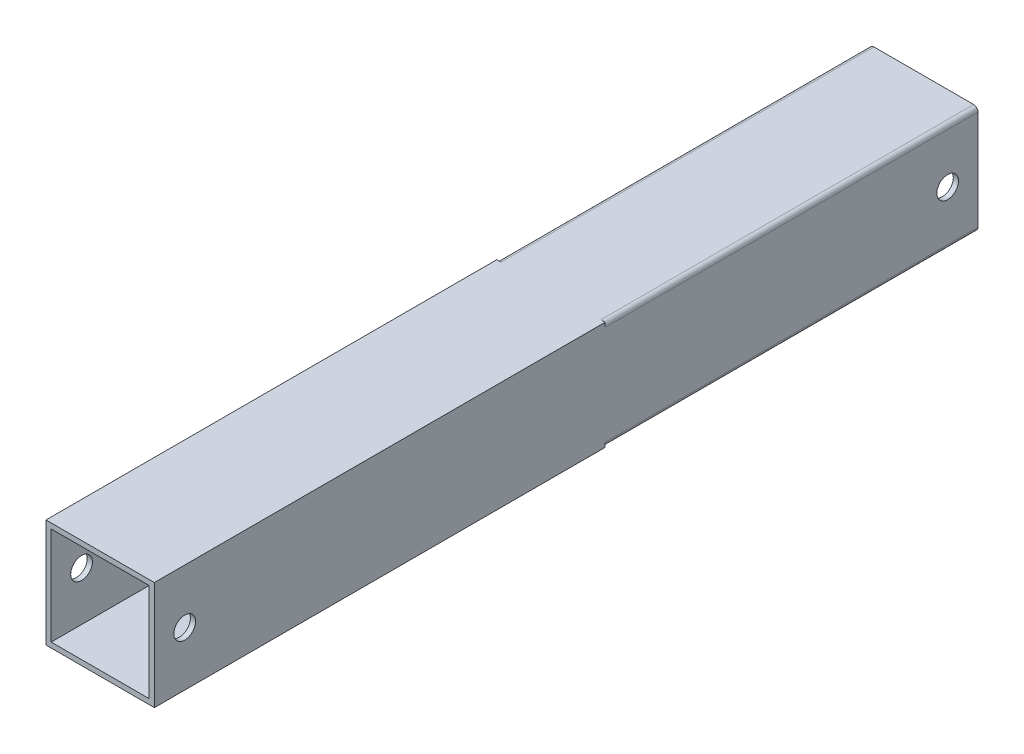
ISO-10303-21;
HEADER;
FILE_DESCRIPTION(('STEP AP214'),'2;1');
FILE_NAME('part.step','',(''),(''),'','','');
FILE_SCHEMA(('AUTOMOTIVE_DESIGN { 1 0 10303 214 1 1 1 1 }'));
ENDSEC;
DATA;
#1=APPLICATION_CONTEXT('core data for automotive mechanical design processes');
#2=APPLICATION_PROTOCOL_DEFINITION('international standard','automotive_design',2000,#1);
#3=PRODUCT_CONTEXT('',#1,'mechanical');
#4=PRODUCT('Part','Part','',(#3));
#5=PRODUCT_RELATED_PRODUCT_CATEGORY('part','',(#4));
#6=PRODUCT_DEFINITION_FORMATION('','',#4);
#7=PRODUCT_DEFINITION_CONTEXT('part definition',#1,'design');
#8=PRODUCT_DEFINITION('design','',#6,#7);
#9=PRODUCT_DEFINITION_SHAPE('','',#8);
#10=(LENGTH_UNIT() NAMED_UNIT(*) SI_UNIT(.MILLI.,.METRE.));
#11=(NAMED_UNIT(*) PLANE_ANGLE_UNIT() SI_UNIT($,.RADIAN.));
#12=(NAMED_UNIT(*) SI_UNIT($,.STERADIAN.) SOLID_ANGLE_UNIT());
#13=UNCERTAINTY_MEASURE_WITH_UNIT(LENGTH_MEASURE(1.E-05),#10,'distance_accuracy_value','');
#14=(GEOMETRIC_REPRESENTATION_CONTEXT(3) GLOBAL_UNCERTAINTY_ASSIGNED_CONTEXT((#13)) GLOBAL_UNIT_ASSIGNED_CONTEXT((#10,
#11,#12)) REPRESENTATION_CONTEXT('',''));
#15=CARTESIAN_POINT('',(0.,0.,0.));
#16=DIRECTION('',(0.,0.,1.));
#17=DIRECTION('',(1.,0.,0.));
#18=AXIS2_PLACEMENT_3D('',#15,#16,#17);
#19=CARTESIAN_POINT('',(0.,0.,0.));
#20=DIRECTION('',(0.,0.,1.));
#21=DIRECTION('',(1.,0.,0.));
#22=AXIS2_PLACEMENT_3D('',#19,#20,#21);
#23=PLANE('',#22);
#24=DIRECTION('',(0.,-1.,0.));
#25=VECTOR('',#24,1.);
#26=CARTESIAN_POINT('',(-11.3,11.3,0.));
#27=LINE('',#26,#25);
#28=CARTESIAN_POINT('',(-11.3,11.3,0.));
#29=VERTEX_POINT('',#28);
#30=CARTESIAN_POINT('',(-11.3,-11.3,0.));
#31=VERTEX_POINT('',#30);
#32=EDGE_CURVE('E203',#29,#31,#27,.T.);
#33=ORIENTED_EDGE('',*,*,#32,.T.);
#34=DIRECTION('',(1.,0.,0.));
#35=VECTOR('',#34,1.);
#36=CARTESIAN_POINT('',(-11.3,-11.3,0.));
#37=LINE('',#36,#35);
#38=CARTESIAN_POINT('',(11.3,-11.3,0.));
#39=VERTEX_POINT('',#38);
#40=EDGE_CURVE('E217',#31,#39,#37,.T.);
#41=ORIENTED_EDGE('',*,*,#40,.T.);
#42=DIRECTION('',(0.,1.,0.));
#43=VECTOR('',#42,1.);
#44=CARTESIAN_POINT('',(11.3,11.3,0.));
#45=LINE('',#44,#43);
#46=CARTESIAN_POINT('',(11.3,11.3,0.));
#47=VERTEX_POINT('',#46);
#48=EDGE_CURVE('E220',#39,#47,#45,.T.);
#49=ORIENTED_EDGE('',*,*,#48,.T.);
#50=DIRECTION('',(-1.,0.,0.));
#51=VECTOR('',#50,1.);
#52=CARTESIAN_POINT('',(-11.3,11.3,0.));
#53=LINE('',#52,#51);
#54=EDGE_CURVE('E207',#47,#29,#53,.T.);
#55=ORIENTED_EDGE('',*,*,#54,.T.);
#56=EDGE_LOOP('',(#33,#41,#49,#55));
#57=FACE_BOUND('',#56,.T.);
#58=CARTESIAN_POINT('',(-11.5,11.5,0.));
#59=DIRECTION('',(0.,0.,-1.));
#60=DIRECTION('',(1.,0.,0.));
#61=AXIS2_PLACEMENT_3D('',#58,#59,#60);
#62=CIRCLE('',#61,1.);
#63=CARTESIAN_POINT('',(-12.5,11.5,0.));
#64=VERTEX_POINT('',#63);
#65=CARTESIAN_POINT('',(-11.5,12.5,0.));
#66=VERTEX_POINT('',#65);
#67=EDGE_CURVE('E55',#64,#66,#62,.T.);
#68=ORIENTED_EDGE('',*,*,#67,.T.);
#69=DIRECTION('',(-1.,0.,0.));
#70=VECTOR('',#69,1.);
#71=CARTESIAN_POINT('',(-12.5,12.5,0.));
#72=LINE('',#71,#70);
#73=CARTESIAN_POINT('',(11.5,12.5,0.));
#74=VERTEX_POINT('',#73);
#75=EDGE_CURVE('E167',#74,#66,#72,.T.);
#76=ORIENTED_EDGE('',*,*,#75,.F.);
#77=CARTESIAN_POINT('',(11.5,11.5,0.));
#78=DIRECTION('',(0.,0.,-1.));
#79=DIRECTION('',(1.,0.,0.));
#80=AXIS2_PLACEMENT_3D('',#77,#78,#79);
#81=CIRCLE('',#80,1.);
#82=CARTESIAN_POINT('',(12.5,11.5,0.));
#83=VERTEX_POINT('',#82);
#84=EDGE_CURVE('E47',#74,#83,#81,.T.);
#85=ORIENTED_EDGE('',*,*,#84,.T.);
#86=DIRECTION('',(0.,1.,0.));
#87=VECTOR('',#86,1.);
#88=CARTESIAN_POINT('',(12.5,12.5,0.));
#89=LINE('',#88,#87);
#90=CARTESIAN_POINT('',(12.5,-11.5,0.));
#91=VERTEX_POINT('',#90);
#92=EDGE_CURVE('E234',#91,#83,#89,.T.);
#93=ORIENTED_EDGE('',*,*,#92,.F.);
#94=CARTESIAN_POINT('',(11.5,-11.5,0.));
#95=DIRECTION('',(0.,0.,-1.));
#96=DIRECTION('',(-1.,0.,0.));
#97=AXIS2_PLACEMENT_3D('',#94,#95,#96);
#98=CIRCLE('',#97,1.);
#99=CARTESIAN_POINT('',(11.5,-12.5,0.));
#100=VERTEX_POINT('',#99);
#101=EDGE_CURVE('E370',#91,#100,#98,.T.);
#102=ORIENTED_EDGE('',*,*,#101,.T.);
#103=DIRECTION('',(1.,0.,0.));
#104=VECTOR('',#103,1.);
#105=CARTESIAN_POINT('',(-12.5,-12.5,0.));
#106=LINE('',#105,#104);
#107=CARTESIAN_POINT('',(-11.5,-12.5,0.));
#108=VERTEX_POINT('',#107);
#109=EDGE_CURVE('E239',#108,#100,#106,.T.);
#110=ORIENTED_EDGE('',*,*,#109,.F.);
#111=CARTESIAN_POINT('',(-11.5,-11.5,0.));
#112=DIRECTION('',(0.,0.,-1.));
#113=DIRECTION('',(1.,0.,0.));
#114=AXIS2_PLACEMENT_3D('',#111,#112,#113);
#115=CIRCLE('',#114,1.);
#116=CARTESIAN_POINT('',(-12.5,-11.5,0.));
#117=VERTEX_POINT('',#116);
#118=EDGE_CURVE('E162',#108,#117,#115,.T.);
#119=ORIENTED_EDGE('',*,*,#118,.T.);
#120=DIRECTION('',(0.,-1.,0.));
#121=VECTOR('',#120,1.);
#122=CARTESIAN_POINT('',(-12.5,12.5,0.));
#123=LINE('',#122,#121);
#124=EDGE_CURVE('E249',#64,#117,#123,.T.);
#125=ORIENTED_EDGE('',*,*,#124,.F.);
#126=EDGE_LOOP('',(#68,#76,#85,#93,#102,#110,#119,#125));
#127=FACE_BOUND('',#126,.T.);
#128=ADVANCED_FACE('F32',(#57,#127),#23,.F.);
#129=CARTESIAN_POINT('',(-12.5,12.5,190.));
#130=DIRECTION('',(0.,-1.,0.));
#131=DIRECTION('',(0.,0.,-1.));
#132=AXIS2_PLACEMENT_3D('',#129,#130,#131);
#133=PLANE('',#132);
#134=DIRECTION('',(0.,0.,-1.));
#135=VECTOR('',#134,1.);
#136=CARTESIAN_POINT('',(-11.5,12.5,86.));
#137=LINE('',#136,#135);
#138=CARTESIAN_POINT('',(-11.5,12.5,86.));
#139=VERTEX_POINT('',#138);
#140=EDGE_CURVE('E159',#139,#66,#137,.T.);
#141=ORIENTED_EDGE('',*,*,#140,.F.);
#142=DIRECTION('',(1.,0.,0.));
#143=VECTOR('',#142,1.);
#144=CARTESIAN_POINT('',(-12.5,12.5,86.));
#145=LINE('',#144,#143);
#146=CARTESIAN_POINT('',(-12.5,12.5,86.));
#147=VERTEX_POINT('',#146);
#148=EDGE_CURVE('E146',#147,#139,#145,.T.);
#149=ORIENTED_EDGE('',*,*,#148,.F.);
#150=DIRECTION('',(0.,0.,-1.));
#151=VECTOR('',#150,1.);
#152=CARTESIAN_POINT('',(-12.5,12.5,190.));
#153=LINE('',#152,#151);
#154=CARTESIAN_POINT('',(-12.5,12.5,190.));
#155=VERTEX_POINT('',#154);
#156=EDGE_CURVE('E259',#155,#147,#153,.T.);
#157=ORIENTED_EDGE('',*,*,#156,.F.);
#158=DIRECTION('',(-1.,0.,0.));
#159=VECTOR('',#158,1.);
#160=CARTESIAN_POINT('',(-12.5,12.5,190.));
#161=LINE('',#160,#159);
#162=CARTESIAN_POINT('',(12.5,12.5,190.));
#163=VERTEX_POINT('',#162);
#164=EDGE_CURVE('E238',#163,#155,#161,.T.);
#165=ORIENTED_EDGE('',*,*,#164,.F.);
#166=DIRECTION('',(0.,0.,-1.));
#167=VECTOR('',#166,1.);
#168=CARTESIAN_POINT('',(12.5,12.5,190.));
#169=LINE('',#168,#167);
#170=CARTESIAN_POINT('',(12.5,12.5,86.));
#171=VERTEX_POINT('',#170);
#172=EDGE_CURVE('E261',#163,#171,#169,.T.);
#173=ORIENTED_EDGE('',*,*,#172,.T.);
#174=CARTESIAN_POINT('',(11.5,12.5,86.));
#175=VERTEX_POINT('',#174);
#176=EDGE_CURVE('E156',#175,#171,#145,.T.);
#177=ORIENTED_EDGE('',*,*,#176,.F.);
#178=DIRECTION('',(0.,0.,-1.));
#179=VECTOR('',#178,1.);
#180=CARTESIAN_POINT('',(11.5,12.5,86.));
#181=LINE('',#180,#179);
#182=EDGE_CURVE('E168',#175,#74,#181,.T.);
#183=ORIENTED_EDGE('',*,*,#182,.T.);
#184=ORIENTED_EDGE('',*,*,#75,.T.);
#185=EDGE_LOOP('',(#141,#149,#157,#165,#173,#177,#183,#184));
#186=FACE_BOUND('',#185,.T.);
#187=ADVANCED_FACE('F165',(#186),#133,.F.);
#188=CARTESIAN_POINT('',(0.,0.,190.));
#189=DIRECTION('',(0.,0.,1.));
#190=DIRECTION('',(1.,0.,0.));
#191=AXIS2_PLACEMENT_3D('',#188,#189,#190);
#192=PLANE('',#191);
#193=DIRECTION('',(0.,1.,0.));
#194=VECTOR('',#193,1.);
#195=CARTESIAN_POINT('',(12.5,12.5,190.));
#196=LINE('',#195,#194);
#197=CARTESIAN_POINT('',(12.5,-12.5,190.));
#198=VERTEX_POINT('',#197);
#199=EDGE_CURVE('E235',#198,#163,#196,.T.);
#200=ORIENTED_EDGE('',*,*,#199,.T.);
#201=ORIENTED_EDGE('',*,*,#164,.T.);
#202=DIRECTION('',(0.,-1.,0.));
#203=VECTOR('',#202,1.);
#204=CARTESIAN_POINT('',(-12.5,12.5,190.));
#205=LINE('',#204,#203);
#206=CARTESIAN_POINT('',(-12.5,-12.5,190.));
#207=VERTEX_POINT('',#206);
#208=EDGE_CURVE('E241',#155,#207,#205,.T.);
#209=ORIENTED_EDGE('',*,*,#208,.T.);
#210=DIRECTION('',(1.,0.,0.));
#211=VECTOR('',#210,1.);
#212=CARTESIAN_POINT('',(-12.5,-12.5,190.));
#213=LINE('',#212,#211);
#214=EDGE_CURVE('E243',#207,#198,#213,.T.);
#215=ORIENTED_EDGE('',*,*,#214,.T.);
#216=EDGE_LOOP('',(#200,#201,#209,#215));
#217=FACE_BOUND('',#216,.T.);
#218=DIRECTION('',(1.,0.,0.));
#219=VECTOR('',#218,1.);
#220=CARTESIAN_POINT('',(-11.3,-11.3,190.));
#221=LINE('',#220,#219);
#222=CARTESIAN_POINT('',(-11.3,-11.3,190.));
#223=VERTEX_POINT('',#222);
#224=CARTESIAN_POINT('',(11.3,-11.3,190.));
#225=VERTEX_POINT('',#224);
#226=EDGE_CURVE('E206',#223,#225,#221,.T.);
#227=ORIENTED_EDGE('',*,*,#226,.F.);
#228=DIRECTION('',(0.,-1.,0.));
#229=VECTOR('',#228,1.);
#230=CARTESIAN_POINT('',(-11.3,11.3,190.));
#231=LINE('',#230,#229);
#232=CARTESIAN_POINT('',(-11.3,11.3,190.));
#233=VERTEX_POINT('',#232);
#234=EDGE_CURVE('E204',#233,#223,#231,.T.);
#235=ORIENTED_EDGE('',*,*,#234,.F.);
#236=DIRECTION('',(-1.,0.,0.));
#237=VECTOR('',#236,1.);
#238=CARTESIAN_POINT('',(-11.3,11.3,190.));
#239=LINE('',#238,#237);
#240=CARTESIAN_POINT('',(11.3,11.3,190.));
#241=VERTEX_POINT('',#240);
#242=EDGE_CURVE('E212',#241,#233,#239,.T.);
#243=ORIENTED_EDGE('',*,*,#242,.F.);
#244=DIRECTION('',(0.,1.,0.));
#245=VECTOR('',#244,1.);
#246=CARTESIAN_POINT('',(11.3,11.3,190.));
#247=LINE('',#246,#245);
#248=EDGE_CURVE('E209',#225,#241,#247,.T.);
#249=ORIENTED_EDGE('',*,*,#248,.F.);
#250=EDGE_LOOP('',(#227,#235,#243,#249));
#251=FACE_BOUND('',#250,.T.);
#252=ADVANCED_FACE('F294',(#217,#251),#192,.T.);
#253=CARTESIAN_POINT('',(12.5,12.5,190.));
#254=DIRECTION('',(-1.,0.,0.));
#255=DIRECTION('',(0.,-1.,0.));
#256=AXIS2_PLACEMENT_3D('',#253,#254,#255);
#257=PLANE('',#256);
#258=CARTESIAN_POINT('',(12.5,0.,7.));
#259=DIRECTION('',(1.,0.,0.));
#260=DIRECTION('',(0.,1.,0.));
#261=AXIS2_PLACEMENT_3D('',#258,#259,#260);
#262=CIRCLE('',#261,2.5);
#263=CARTESIAN_POINT('',(12.5,2.5,7.));
#264=VERTEX_POINT('',#263);
#265=EDGE_CURVE('E193',#264,#264,#262,.T.);
#266=ORIENTED_EDGE('',*,*,#265,.F.);
#267=EDGE_LOOP('',(#266));
#268=FACE_BOUND('',#267,.T.);
#269=DIRECTION('',(0.,0.,-1.));
#270=VECTOR('',#269,1.);
#271=CARTESIAN_POINT('',(12.5,11.5,86.));
#272=LINE('',#271,#270);
#273=CARTESIAN_POINT('',(12.5,11.5,86.));
#274=VERTEX_POINT('',#273);
#275=EDGE_CURVE('E171',#274,#83,#272,.T.);
#276=ORIENTED_EDGE('',*,*,#275,.F.);
#277=DIRECTION('',(0.,-1.,0.));
#278=VECTOR('',#277,1.);
#279=CARTESIAN_POINT('',(12.5,12.5,86.));
#280=LINE('',#279,#278);
#281=EDGE_CURVE('E181',#171,#274,#280,.T.);
#282=ORIENTED_EDGE('',*,*,#281,.F.);
#283=ORIENTED_EDGE('',*,*,#172,.F.);
#284=ORIENTED_EDGE('',*,*,#199,.F.);
#285=DIRECTION('',(0.,0.,-1.));
#286=VECTOR('',#285,1.);
#287=CARTESIAN_POINT('',(12.5,-12.5,190.));
#288=LINE('',#287,#286);
#289=CARTESIAN_POINT('',(12.5,-12.5,86.));
#290=VERTEX_POINT('',#289);
#291=EDGE_CURVE('E245',#198,#290,#288,.T.);
#292=ORIENTED_EDGE('',*,*,#291,.T.);
#293=CARTESIAN_POINT('',(12.5,-11.5,86.));
#294=VERTEX_POINT('',#293);
#295=EDGE_CURVE('E180',#294,#290,#280,.T.);
#296=ORIENTED_EDGE('',*,*,#295,.F.);
#297=DIRECTION('',(0.,0.,-1.));
#298=VECTOR('',#297,1.);
#299=CARTESIAN_POINT('',(12.5,-11.5,86.));
#300=LINE('',#299,#298);
#301=EDGE_CURVE('E386',#294,#91,#300,.T.);
#302=ORIENTED_EDGE('',*,*,#301,.T.);
#303=ORIENTED_EDGE('',*,*,#92,.T.);
#304=EDGE_LOOP('',(#276,#282,#283,#284,#292,#296,#302,#303));
#305=FACE_BOUND('',#304,.T.);
#306=CARTESIAN_POINT('',(12.5,0.,183.));
#307=DIRECTION('',(1.,0.,0.));
#308=DIRECTION('',(0.,1.,0.));
#309=AXIS2_PLACEMENT_3D('',#306,#307,#308);
#310=CIRCLE('',#309,2.5);
#311=CARTESIAN_POINT('',(12.5,2.49999999999997,183.));
#312=VERTEX_POINT('',#311);
#313=EDGE_CURVE('E187',#312,#312,#310,.T.);
#314=ORIENTED_EDGE('',*,*,#313,.F.);
#315=EDGE_LOOP('',(#314));
#316=FACE_BOUND('',#315,.T.);
#317=ADVANCED_FACE('F34',(#268,#305,#316),#257,.F.);
#318=CARTESIAN_POINT('',(-12.5,12.5,190.));
#319=DIRECTION('',(1.,0.,0.));
#320=DIRECTION('',(0.,1.,0.));
#321=AXIS2_PLACEMENT_3D('',#318,#319,#320);
#322=PLANE('',#321);
#323=CARTESIAN_POINT('',(-12.5,0.,7.));
#324=DIRECTION('',(1.,0.,0.));
#325=DIRECTION('',(0.,1.,0.));
#326=AXIS2_PLACEMENT_3D('',#323,#324,#325);
#327=CIRCLE('',#326,2.5);
#328=CARTESIAN_POINT('',(-12.5,2.5,7.));
#329=VERTEX_POINT('',#328);
#330=EDGE_CURVE('E194',#329,#329,#327,.T.);
#331=ORIENTED_EDGE('',*,*,#330,.T.);
#332=EDGE_LOOP('',(#331));
#333=FACE_BOUND('',#332,.T.);
#334=DIRECTION('',(0.,0.,-1.));
#335=VECTOR('',#334,1.);
#336=CARTESIAN_POINT('',(-12.5,-11.5,86.));
#337=LINE('',#336,#335);
#338=CARTESIAN_POINT('',(-12.5,-11.5,86.));
#339=VERTEX_POINT('',#338);
#340=EDGE_CURVE('E329',#339,#117,#337,.T.);
#341=ORIENTED_EDGE('',*,*,#340,.F.);
#342=DIRECTION('',(0.,1.,0.));
#343=VECTOR('',#342,1.);
#344=CARTESIAN_POINT('',(-12.5,12.5,86.));
#345=LINE('',#344,#343);
#346=CARTESIAN_POINT('',(-12.5,-12.5,86.));
#347=VERTEX_POINT('',#346);
#348=EDGE_CURVE('E178',#347,#339,#345,.T.);
#349=ORIENTED_EDGE('',*,*,#348,.F.);
#350=DIRECTION('',(0.,0.,-1.));
#351=VECTOR('',#350,1.);
#352=CARTESIAN_POINT('',(-12.5,-12.5,190.));
#353=LINE('',#352,#351);
#354=EDGE_CURVE('E256',#207,#347,#353,.T.);
#355=ORIENTED_EDGE('',*,*,#354,.F.);
#356=ORIENTED_EDGE('',*,*,#208,.F.);
#357=ORIENTED_EDGE('',*,*,#156,.T.);
#358=CARTESIAN_POINT('',(-12.5,11.5,86.));
#359=VERTEX_POINT('',#358);
#360=EDGE_CURVE('E151',#359,#147,#345,.T.);
#361=ORIENTED_EDGE('',*,*,#360,.F.);
#362=DIRECTION('',(0.,0.,-1.));
#363=VECTOR('',#362,1.);
#364=CARTESIAN_POINT('',(-12.5,11.5,86.));
#365=LINE('',#364,#363);
#366=EDGE_CURVE('E160',#359,#64,#365,.T.);
#367=ORIENTED_EDGE('',*,*,#366,.T.);
#368=ORIENTED_EDGE('',*,*,#124,.T.);
#369=EDGE_LOOP('',(#341,#349,#355,#356,#357,#361,#367,#368));
#370=FACE_BOUND('',#369,.T.);
#371=CARTESIAN_POINT('',(-12.5,0.,183.));
#372=DIRECTION('',(1.,0.,0.));
#373=DIRECTION('',(0.,1.,0.));
#374=AXIS2_PLACEMENT_3D('',#371,#372,#373);
#375=CIRCLE('',#374,2.5);
#376=CARTESIAN_POINT('',(-12.5,2.49999999999997,183.));
#377=VERTEX_POINT('',#376);
#378=EDGE_CURVE('E183',#377,#377,#375,.T.);
#379=ORIENTED_EDGE('',*,*,#378,.T.);
#380=EDGE_LOOP('',(#379));
#381=FACE_BOUND('',#380,.T.);
#382=ADVANCED_FACE('F316',(#333,#370,#381),#322,.F.);
#383=CARTESIAN_POINT('',(-12.5,-12.5,190.));
#384=DIRECTION('',(0.,1.,0.));
#385=DIRECTION('',(0.,0.,1.));
#386=AXIS2_PLACEMENT_3D('',#383,#384,#385);
#387=PLANE('',#386);
#388=DIRECTION('',(0.,0.,-1.));
#389=VECTOR('',#388,1.);
#390=CARTESIAN_POINT('',(11.5,-12.5,86.));
#391=LINE('',#390,#389);
#392=CARTESIAN_POINT('',(11.5,-12.5,86.));
#393=VERTEX_POINT('',#392);
#394=EDGE_CURVE('E374',#393,#100,#391,.T.);
#395=ORIENTED_EDGE('',*,*,#394,.F.);
#396=DIRECTION('',(-1.,0.,0.));
#397=VECTOR('',#396,1.);
#398=CARTESIAN_POINT('',(-12.5,-12.5,86.));
#399=LINE('',#398,#397);
#400=EDGE_CURVE('E11',#290,#393,#399,.T.);
#401=ORIENTED_EDGE('',*,*,#400,.F.);
#402=ORIENTED_EDGE('',*,*,#291,.F.);
#403=ORIENTED_EDGE('',*,*,#214,.F.);
#404=ORIENTED_EDGE('',*,*,#354,.T.);
#405=CARTESIAN_POINT('',(-11.5,-12.5,86.));
#406=VERTEX_POINT('',#405);
#407=EDGE_CURVE('E40',#406,#347,#399,.T.);
#408=ORIENTED_EDGE('',*,*,#407,.F.);
#409=DIRECTION('',(0.,0.,-1.));
#410=VECTOR('',#409,1.);
#411=CARTESIAN_POINT('',(-11.5,-12.5,86.));
#412=LINE('',#411,#410);
#413=EDGE_CURVE('E366',#406,#108,#412,.T.);
#414=ORIENTED_EDGE('',*,*,#413,.T.);
#415=ORIENTED_EDGE('',*,*,#109,.T.);
#416=EDGE_LOOP('',(#395,#401,#402,#403,#404,#408,#414,#415));
#417=FACE_BOUND('',#416,.T.);
#418=ADVANCED_FACE('F313',(#417),#387,.F.);
#419=CARTESIAN_POINT('',(-11.3,11.3,190.));
#420=DIRECTION('',(1.,0.,0.));
#421=DIRECTION('',(0.,1.,0.));
#422=AXIS2_PLACEMENT_3D('',#419,#420,#421);
#423=PLANE('',#422);
#424=CARTESIAN_POINT('',(-11.3,0.,183.));
#425=DIRECTION('',(1.,0.,0.));
#426=DIRECTION('',(0.,1.,0.));
#427=AXIS2_PLACEMENT_3D('',#424,#425,#426);
#428=CIRCLE('',#427,2.5);
#429=CARTESIAN_POINT('',(-11.3,2.49999999999997,183.));
#430=VERTEX_POINT('',#429);
#431=EDGE_CURVE('E190',#430,#430,#428,.T.);
#432=ORIENTED_EDGE('',*,*,#431,.F.);
#433=EDGE_LOOP('',(#432));
#434=FACE_BOUND('',#433,.T.);
#435=CARTESIAN_POINT('',(-11.3,0.,7.));
#436=DIRECTION('',(1.,0.,0.));
#437=DIRECTION('',(0.,1.,0.));
#438=AXIS2_PLACEMENT_3D('',#435,#436,#437);
#439=CIRCLE('',#438,2.5);
#440=CARTESIAN_POINT('',(-11.3,2.5,7.));
#441=VERTEX_POINT('',#440);
#442=EDGE_CURVE('E200',#441,#441,#439,.T.);
#443=ORIENTED_EDGE('',*,*,#442,.F.);
#444=EDGE_LOOP('',(#443));
#445=FACE_BOUND('',#444,.T.);
#446=ORIENTED_EDGE('',*,*,#32,.F.);
#447=DIRECTION('',(0.,0.,-1.));
#448=VECTOR('',#447,1.);
#449=CARTESIAN_POINT('',(-11.3,11.3,190.));
#450=LINE('',#449,#448);
#451=EDGE_CURVE('E214',#233,#29,#450,.T.);
#452=ORIENTED_EDGE('',*,*,#451,.F.);
#453=ORIENTED_EDGE('',*,*,#234,.T.);
#454=DIRECTION('',(0.,0.,-1.));
#455=VECTOR('',#454,1.);
#456=CARTESIAN_POINT('',(-11.3,-11.3,190.));
#457=LINE('',#456,#455);
#458=EDGE_CURVE('E231',#223,#31,#457,.T.);
#459=ORIENTED_EDGE('',*,*,#458,.T.);
#460=EDGE_LOOP('',(#446,#452,#453,#459));
#461=FACE_BOUND('',#460,.T.);
#462=ADVANCED_FACE('F289',(#434,#445,#461),#423,.T.);
#463=CARTESIAN_POINT('',(-11.3,-11.3,190.));
#464=DIRECTION('',(0.,1.,0.));
#465=DIRECTION('',(0.,0.,1.));
#466=AXIS2_PLACEMENT_3D('',#463,#464,#465);
#467=PLANE('',#466);
#468=ORIENTED_EDGE('',*,*,#40,.F.);
#469=ORIENTED_EDGE('',*,*,#458,.F.);
#470=ORIENTED_EDGE('',*,*,#226,.T.);
#471=DIRECTION('',(0.,0.,-1.));
#472=VECTOR('',#471,1.);
#473=CARTESIAN_POINT('',(11.3,-11.3,190.));
#474=LINE('',#473,#472);
#475=EDGE_CURVE('E229',#225,#39,#474,.T.);
#476=ORIENTED_EDGE('',*,*,#475,.T.);
#477=EDGE_LOOP('',(#468,#469,#470,#476));
#478=FACE_BOUND('',#477,.T.);
#479=ADVANCED_FACE('F275',(#478),#467,.T.);
#480=CARTESIAN_POINT('',(11.3,11.3,190.));
#481=DIRECTION('',(-1.,0.,0.));
#482=DIRECTION('',(0.,-1.,0.));
#483=AXIS2_PLACEMENT_3D('',#480,#481,#482);
#484=PLANE('',#483);
#485=CARTESIAN_POINT('',(11.3,0.,183.));
#486=DIRECTION('',(-1.,0.,0.));
#487=DIRECTION('',(0.,-1.,0.));
#488=AXIS2_PLACEMENT_3D('',#485,#486,#487);
#489=CIRCLE('',#488,2.5);
#490=CARTESIAN_POINT('',(11.3,-2.50000000000002,183.));
#491=VERTEX_POINT('',#490);
#492=EDGE_CURVE('E186',#491,#491,#489,.T.);
#493=ORIENTED_EDGE('',*,*,#492,.F.);
#494=EDGE_LOOP('',(#493));
#495=FACE_BOUND('',#494,.T.);
#496=CARTESIAN_POINT('',(11.3,0.,7.));
#497=DIRECTION('',(-1.,0.,0.));
#498=DIRECTION('',(0.,-1.,0.));
#499=AXIS2_PLACEMENT_3D('',#496,#497,#498);
#500=CIRCLE('',#499,2.5);
#501=CARTESIAN_POINT('',(11.3,-2.5,7.));
#502=VERTEX_POINT('',#501);
#503=EDGE_CURVE('E197',#502,#502,#500,.T.);
#504=ORIENTED_EDGE('',*,*,#503,.F.);
#505=EDGE_LOOP('',(#504));
#506=FACE_BOUND('',#505,.T.);
#507=ORIENTED_EDGE('',*,*,#48,.F.);
#508=ORIENTED_EDGE('',*,*,#475,.F.);
#509=ORIENTED_EDGE('',*,*,#248,.T.);
#510=DIRECTION('',(0.,0.,-1.));
#511=VECTOR('',#510,1.);
#512=CARTESIAN_POINT('',(11.3,11.3,190.));
#513=LINE('',#512,#511);
#514=EDGE_CURVE('E227',#241,#47,#513,.T.);
#515=ORIENTED_EDGE('',*,*,#514,.T.);
#516=EDGE_LOOP('',(#507,#508,#509,#515));
#517=FACE_BOUND('',#516,.T.);
#518=ADVANCED_FACE('F271',(#495,#506,#517),#484,.T.);
#519=CARTESIAN_POINT('',(-11.3,11.3,190.));
#520=DIRECTION('',(0.,-1.,0.));
#521=DIRECTION('',(0.,0.,-1.));
#522=AXIS2_PLACEMENT_3D('',#519,#520,#521);
#523=PLANE('',#522);
#524=ORIENTED_EDGE('',*,*,#54,.F.);
#525=ORIENTED_EDGE('',*,*,#514,.F.);
#526=ORIENTED_EDGE('',*,*,#242,.T.);
#527=ORIENTED_EDGE('',*,*,#451,.T.);
#528=EDGE_LOOP('',(#524,#525,#526,#527));
#529=FACE_BOUND('',#528,.T.);
#530=ADVANCED_FACE('F274',(#529),#523,.T.);
#531=CARTESIAN_POINT('',(-12.5,0.,7.));
#532=DIRECTION('',(1.,0.,0.));
#533=DIRECTION('',(0.,1.,0.));
#534=AXIS2_PLACEMENT_3D('',#531,#532,#533);
#535=CYLINDRICAL_SURFACE('',#534,2.5);
#536=ORIENTED_EDGE('',*,*,#503,.T.);
#537=EDGE_LOOP('',(#536));
#538=FACE_BOUND('',#537,.T.);
#539=ORIENTED_EDGE('',*,*,#265,.T.);
#540=EDGE_LOOP('',(#539));
#541=FACE_BOUND('',#540,.T.);
#542=ADVANCED_FACE('F297',(#538,#541),#535,.F.);
#543=ORIENTED_EDGE('',*,*,#442,.T.);
#544=EDGE_LOOP('',(#543));
#545=FACE_BOUND('',#544,.T.);
#546=ORIENTED_EDGE('',*,*,#330,.F.);
#547=EDGE_LOOP('',(#546));
#548=FACE_BOUND('',#547,.T.);
#549=ADVANCED_FACE('F302',(#545,#548),#535,.F.);
#550=CARTESIAN_POINT('',(-12.5,0.,183.));
#551=DIRECTION('',(1.,0.,0.));
#552=DIRECTION('',(0.,1.,0.));
#553=AXIS2_PLACEMENT_3D('',#550,#551,#552);
#554=CYLINDRICAL_SURFACE('',#553,2.5);
#555=ORIENTED_EDGE('',*,*,#492,.T.);
#556=EDGE_LOOP('',(#555));
#557=FACE_BOUND('',#556,.T.);
#558=ORIENTED_EDGE('',*,*,#313,.T.);
#559=EDGE_LOOP('',(#558));
#560=FACE_BOUND('',#559,.T.);
#561=ADVANCED_FACE('F268',(#557,#560),#554,.F.);
#562=ORIENTED_EDGE('',*,*,#431,.T.);
#563=EDGE_LOOP('',(#562));
#564=FACE_BOUND('',#563,.T.);
#565=ORIENTED_EDGE('',*,*,#378,.F.);
#566=EDGE_LOOP('',(#565));
#567=FACE_BOUND('',#566,.T.);
#568=ADVANCED_FACE('F332',(#564,#567),#554,.F.);
#569=CARTESIAN_POINT('',(11.5,-11.5,86.));
#570=DIRECTION('',(0.,0.,-1.));
#571=DIRECTION('',(-1.,0.,0.));
#572=AXIS2_PLACEMENT_3D('',#569,#570,#571);
#573=CYLINDRICAL_SURFACE('',#572,1.);
#574=ORIENTED_EDGE('',*,*,#101,.F.);
#575=ORIENTED_EDGE('',*,*,#301,.F.);
#576=CARTESIAN_POINT('',(11.5,-11.5,86.));
#577=DIRECTION('',(0.,0.,-1.));
#578=DIRECTION('',(-1.,0.,0.));
#579=AXIS2_PLACEMENT_3D('',#576,#577,#578);
#580=CIRCLE('',#579,1.);
#581=EDGE_CURVE('E174',#294,#393,#580,.T.);
#582=ORIENTED_EDGE('',*,*,#581,.T.);
#583=ORIENTED_EDGE('',*,*,#394,.T.);
#584=EDGE_LOOP('',(#574,#575,#582,#583));
#585=FACE_BOUND('',#584,.T.);
#586=ADVANCED_FACE('F334',(#585),#573,.T.);
#587=CARTESIAN_POINT('',(0.,0.,86.));
#588=DIRECTION('',(0.,0.,-1.));
#589=DIRECTION('',(-1.,0.,0.));
#590=AXIS2_PLACEMENT_3D('',#587,#588,#589);
#591=PLANE('',#590);
#592=ORIENTED_EDGE('',*,*,#295,.T.);
#593=ORIENTED_EDGE('',*,*,#400,.T.);
#594=ORIENTED_EDGE('',*,*,#581,.F.);
#595=EDGE_LOOP('',(#592,#593,#594));
#596=FACE_BOUND('',#595,.T.);
#597=ADVANCED_FACE('F341',(#596),#591,.T.);
#598=CARTESIAN_POINT('',(-11.5,-11.5,86.));
#599=DIRECTION('',(0.,0.,-1.));
#600=DIRECTION('',(-1.,0.,0.));
#601=AXIS2_PLACEMENT_3D('',#598,#599,#600);
#602=CYLINDRICAL_SURFACE('',#601,1.);
#603=ORIENTED_EDGE('',*,*,#118,.F.);
#604=ORIENTED_EDGE('',*,*,#413,.F.);
#605=CARTESIAN_POINT('',(-11.5,-11.5,86.));
#606=DIRECTION('',(0.,0.,-1.));
#607=DIRECTION('',(1.,0.,0.));
#608=AXIS2_PLACEMENT_3D('',#605,#606,#607);
#609=CIRCLE('',#608,1.);
#610=EDGE_CURVE('E169',#406,#339,#609,.T.);
#611=ORIENTED_EDGE('',*,*,#610,.T.);
#612=ORIENTED_EDGE('',*,*,#340,.T.);
#613=EDGE_LOOP('',(#603,#604,#611,#612));
#614=FACE_BOUND('',#613,.T.);
#615=ADVANCED_FACE('F355',(#614),#602,.T.);
#616=ORIENTED_EDGE('',*,*,#348,.T.);
#617=ORIENTED_EDGE('',*,*,#610,.F.);
#618=ORIENTED_EDGE('',*,*,#407,.T.);
#619=EDGE_LOOP('',(#616,#617,#618));
#620=FACE_BOUND('',#619,.T.);
#621=ADVANCED_FACE('F350',(#620),#591,.T.);
#622=CARTESIAN_POINT('',(-11.5,11.5,86.));
#623=DIRECTION('',(0.,0.,-1.));
#624=DIRECTION('',(-1.,0.,0.));
#625=AXIS2_PLACEMENT_3D('',#622,#623,#624);
#626=CYLINDRICAL_SURFACE('',#625,1.);
#627=ORIENTED_EDGE('',*,*,#67,.F.);
#628=ORIENTED_EDGE('',*,*,#366,.F.);
#629=CARTESIAN_POINT('',(-11.5,11.5,86.));
#630=DIRECTION('',(0.,0.,-1.));
#631=DIRECTION('',(1.,0.,0.));
#632=AXIS2_PLACEMENT_3D('',#629,#630,#631);
#633=CIRCLE('',#632,1.);
#634=EDGE_CURVE('E149',#359,#139,#633,.T.);
#635=ORIENTED_EDGE('',*,*,#634,.T.);
#636=ORIENTED_EDGE('',*,*,#140,.T.);
#637=EDGE_LOOP('',(#627,#628,#635,#636));
#638=FACE_BOUND('',#637,.T.);
#639=ADVANCED_FACE('F158',(#638),#626,.T.);
#640=ORIENTED_EDGE('',*,*,#148,.T.);
#641=ORIENTED_EDGE('',*,*,#634,.F.);
#642=ORIENTED_EDGE('',*,*,#360,.T.);
#643=EDGE_LOOP('',(#640,#641,#642));
#644=FACE_BOUND('',#643,.T.);
#645=ADVANCED_FACE('F148',(#644),#591,.T.);
#646=ORIENTED_EDGE('',*,*,#281,.T.);
#647=CARTESIAN_POINT('',(11.5,11.5,86.));
#648=DIRECTION('',(0.,0.,-1.));
#649=DIRECTION('',(1.,0.,0.));
#650=AXIS2_PLACEMENT_3D('',#647,#648,#649);
#651=CIRCLE('',#650,1.);
#652=EDGE_CURVE('E161',#175,#274,#651,.T.);
#653=ORIENTED_EDGE('',*,*,#652,.F.);
#654=ORIENTED_EDGE('',*,*,#176,.T.);
#655=EDGE_LOOP('',(#646,#653,#654));
#656=FACE_BOUND('',#655,.T.);
#657=ADVANCED_FACE('F345',(#656),#591,.T.);
#658=CARTESIAN_POINT('',(11.5,11.5,86.));
#659=DIRECTION('',(0.,0.,-1.));
#660=DIRECTION('',(-1.,0.,0.));
#661=AXIS2_PLACEMENT_3D('',#658,#659,#660);
#662=CYLINDRICAL_SURFACE('',#661,1.);
#663=ORIENTED_EDGE('',*,*,#84,.F.);
#664=ORIENTED_EDGE('',*,*,#182,.F.);
#665=ORIENTED_EDGE('',*,*,#652,.T.);
#666=ORIENTED_EDGE('',*,*,#275,.T.);
#667=EDGE_LOOP('',(#663,#664,#665,#666));
#668=FACE_BOUND('',#667,.T.);
#669=ADVANCED_FACE('F348',(#668),#662,.T.);
#670=CLOSED_SHELL('',(#128,#187,#252,#317,#382,#418,#462,#479,#518,#530,#542,#549,#561,#568,
#586,#597,#615,#621,#639,#645,#657,#669));
#671=MANIFOLD_SOLID_BREP('B2',#670);
#672=ADVANCED_BREP_SHAPE_REPRESENTATION('',(#18,#671),#14);
#673=SHAPE_DEFINITION_REPRESENTATION(#9,#672);
ENDSEC;
END-ISO-10303-21;
